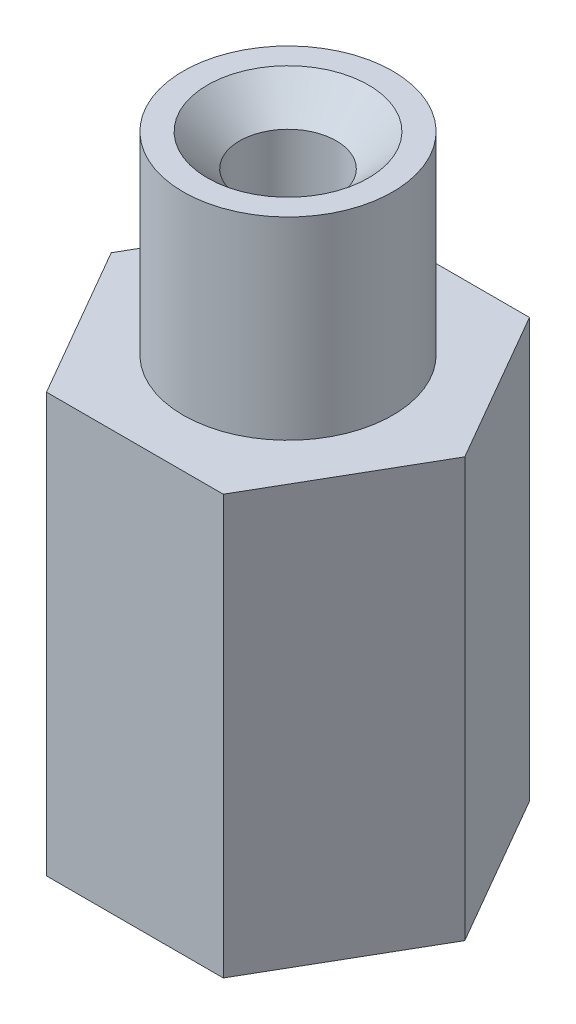
ISO-10303-21;
HEADER;
FILE_DESCRIPTION(('STEP AP214'),'2;1');
FILE_NAME('part.step','',(''),(''),'','','');
FILE_SCHEMA(('AUTOMOTIVE_DESIGN { 1 0 10303 214 1 1 1 1 }'));
ENDSEC;
DATA;
#1=APPLICATION_CONTEXT('core data for automotive mechanical design processes');
#2=APPLICATION_PROTOCOL_DEFINITION('international standard','automotive_design',2000,#1);
#3=PRODUCT_CONTEXT('',#1,'mechanical');
#4=PRODUCT('Part','Part','',(#3));
#5=PRODUCT_RELATED_PRODUCT_CATEGORY('part','',(#4));
#6=PRODUCT_DEFINITION_FORMATION('','',#4);
#7=PRODUCT_DEFINITION_CONTEXT('part definition',#1,'design');
#8=PRODUCT_DEFINITION('design','',#6,#7);
#9=PRODUCT_DEFINITION_SHAPE('','',#8);
#10=(LENGTH_UNIT() NAMED_UNIT(*) SI_UNIT(.MILLI.,.METRE.));
#11=(NAMED_UNIT(*) PLANE_ANGLE_UNIT() SI_UNIT($,.RADIAN.));
#12=(NAMED_UNIT(*) SI_UNIT($,.STERADIAN.) SOLID_ANGLE_UNIT());
#13=UNCERTAINTY_MEASURE_WITH_UNIT(LENGTH_MEASURE(1.E-05),#10,'distance_accuracy_value','');
#14=(GEOMETRIC_REPRESENTATION_CONTEXT(3) GLOBAL_UNCERTAINTY_ASSIGNED_CONTEXT((#13)) GLOBAL_UNIT_ASSIGNED_CONTEXT((#10,
#11,#12)) REPRESENTATION_CONTEXT('',''));
#15=CARTESIAN_POINT('',(0.,0.,0.));
#16=DIRECTION('',(0.,0.,1.));
#17=DIRECTION('',(1.,0.,0.));
#18=AXIS2_PLACEMENT_3D('',#15,#16,#17);
#19=CARTESIAN_POINT('',(0.,-17.,-9.49999999999998));
#20=DIRECTION('',(0.,0.,-1.));
#21=DIRECTION('',(-1.,0.,0.));
#22=AXIS2_PLACEMENT_3D('',#19,#20,#21);
#23=PLANE('',#22);
#24=DIRECTION('',(0.,1.,0.));
#25=VECTOR('',#24,1.);
#26=CARTESIAN_POINT('',(-5.48482755730155,-17.,-9.49999999999992));
#27=LINE('',#26,#25);
#28=CARTESIAN_POINT('',(-5.48482755730155,-17.,-9.49999999999992));
#29=VERTEX_POINT('',#28);
#30=CARTESIAN_POINT('',(-5.48482755730155,9.,-9.49999999999992));
#31=VERTEX_POINT('',#30);
#32=EDGE_CURVE('E99',#29,#31,#27,.T.);
#33=ORIENTED_EDGE('',*,*,#32,.T.);
#34=DIRECTION('',(-1.,0.,0.));
#35=VECTOR('',#34,1.);
#36=CARTESIAN_POINT('',(0.,9.,-9.49999999999998));
#37=LINE('',#36,#35);
#38=CARTESIAN_POINT('',(5.48482755730135,9.,-9.50000000000004));
#39=VERTEX_POINT('',#38);
#40=EDGE_CURVE('E102',#39,#31,#37,.T.);
#41=ORIENTED_EDGE('',*,*,#40,.F.);
#42=DIRECTION('',(0.,1.,0.));
#43=VECTOR('',#42,1.);
#44=CARTESIAN_POINT('',(5.48482755730135,-17.,-9.50000000000004));
#45=LINE('',#44,#43);
#46=CARTESIAN_POINT('',(5.48482755730135,-17.,-9.50000000000004));
#47=VERTEX_POINT('',#46);
#48=EDGE_CURVE('E62',#47,#39,#45,.T.);
#49=ORIENTED_EDGE('',*,*,#48,.F.);
#50=DIRECTION('',(-1.,0.,0.));
#51=VECTOR('',#50,1.);
#52=CARTESIAN_POINT('',(0.,-17.,-9.49999999999998));
#53=LINE('',#52,#51);
#54=EDGE_CURVE('E103',#47,#29,#53,.T.);
#55=ORIENTED_EDGE('',*,*,#54,.T.);
#56=EDGE_LOOP('',(#33,#41,#49,#55));
#57=FACE_BOUND('',#56,.T.);
#58=ADVANCED_FACE('F45',(#57),#23,.T.);
#59=CARTESIAN_POINT('',(8.22724133595211,-17.,-4.75000000000006));
#60=DIRECTION('',(0.866025403784435,0.,-0.500000000000007));
#61=DIRECTION('',(-0.500000000000007,0.,-0.866025403784435));
#62=AXIS2_PLACEMENT_3D('',#59,#60,#61);
#63=PLANE('',#62);
#64=ORIENTED_EDGE('',*,*,#48,.T.);
#65=DIRECTION('',(-0.500000000000007,0.,-0.866025403784435));
#66=VECTOR('',#65,1.);
#67=CARTESIAN_POINT('',(8.22724133595211,9.,-4.75000000000006));
#68=LINE('',#67,#66);
#69=CARTESIAN_POINT('',(10.9696551146029,9.,0.));
#70=VERTEX_POINT('',#69);
#71=EDGE_CURVE('E123',#70,#39,#68,.T.);
#72=ORIENTED_EDGE('',*,*,#71,.F.);
#73=DIRECTION('',(0.,1.,0.));
#74=VECTOR('',#73,1.);
#75=CARTESIAN_POINT('',(10.9696551146029,-17.,0.));
#76=LINE('',#75,#74);
#77=CARTESIAN_POINT('',(10.9696551146029,-17.,0.));
#78=VERTEX_POINT('',#77);
#79=EDGE_CURVE('E70',#78,#70,#76,.T.);
#80=ORIENTED_EDGE('',*,*,#79,.F.);
#81=DIRECTION('',(-0.500000000000007,0.,-0.866025403784435));
#82=VECTOR('',#81,1.);
#83=CARTESIAN_POINT('',(8.22724133595211,-17.,-4.75000000000006));
#84=LINE('',#83,#82);
#85=EDGE_CURVE('E109',#78,#47,#84,.T.);
#86=ORIENTED_EDGE('',*,*,#85,.T.);
#87=EDGE_LOOP('',(#64,#72,#80,#86));
#88=FACE_BOUND('',#87,.T.);
#89=ADVANCED_FACE('F211',(#88),#63,.T.);
#90=CARTESIAN_POINT('',(8.22724133595218,-17.,4.74999999999994));
#91=DIRECTION('',(0.866025403784442,0.,0.499999999999995));
#92=DIRECTION('',(0.499999999999995,0.,-0.866025403784442));
#93=AXIS2_PLACEMENT_3D('',#90,#91,#92);
#94=PLANE('',#93);
#95=ORIENTED_EDGE('',*,*,#79,.T.);
#96=DIRECTION('',(0.499999999999995,0.,-0.866025403784442));
#97=VECTOR('',#96,1.);
#98=CARTESIAN_POINT('',(8.22724133595218,9.,4.74999999999994));
#99=LINE('',#98,#97);
#100=CARTESIAN_POINT('',(5.48482755730148,9.,9.49999999999996));
#101=VERTEX_POINT('',#100);
#102=EDGE_CURVE('E141',#101,#70,#99,.T.);
#103=ORIENTED_EDGE('',*,*,#102,.F.);
#104=DIRECTION('',(0.,1.,0.));
#105=VECTOR('',#104,1.);
#106=CARTESIAN_POINT('',(5.48482755730148,-17.,9.49999999999996));
#107=LINE('',#106,#105);
#108=CARTESIAN_POINT('',(5.48482755730148,-17.,9.49999999999996));
#109=VERTEX_POINT('',#108);
#110=EDGE_CURVE('E169',#109,#101,#107,.T.);
#111=ORIENTED_EDGE('',*,*,#110,.F.);
#112=DIRECTION('',(0.499999999999995,0.,-0.866025403784442));
#113=VECTOR('',#112,1.);
#114=CARTESIAN_POINT('',(8.22724133595218,-17.,4.74999999999994));
#115=LINE('',#114,#113);
#116=EDGE_CURVE('E159',#109,#78,#115,.T.);
#117=ORIENTED_EDGE('',*,*,#116,.T.);
#118=EDGE_LOOP('',(#95,#103,#111,#117));
#119=FACE_BOUND('',#118,.T.);
#120=ADVANCED_FACE('F216',(#119),#94,.T.);
#121=CARTESIAN_POINT('',(0.,-17.,9.49999999999998));
#122=DIRECTION('',(0.,0.,1.));
#123=DIRECTION('',(1.,0.,0.));
#124=AXIS2_PLACEMENT_3D('',#121,#122,#123);
#125=PLANE('',#124);
#126=ORIENTED_EDGE('',*,*,#110,.T.);
#127=DIRECTION('',(1.,0.,0.));
#128=VECTOR('',#127,1.);
#129=CARTESIAN_POINT('',(0.,9.,9.49999999999998));
#130=LINE('',#129,#128);
#131=CARTESIAN_POINT('',(-5.48482755730141,9.,9.5));
#132=VERTEX_POINT('',#131);
#133=EDGE_CURVE('E137',#132,#101,#130,.T.);
#134=ORIENTED_EDGE('',*,*,#133,.F.);
#135=DIRECTION('',(0.,1.,0.));
#136=VECTOR('',#135,1.);
#137=CARTESIAN_POINT('',(-5.48482755730141,-17.,9.5));
#138=LINE('',#137,#136);
#139=CARTESIAN_POINT('',(-5.48482755730141,-17.,9.5));
#140=VERTEX_POINT('',#139);
#141=EDGE_CURVE('E172',#140,#132,#138,.T.);
#142=ORIENTED_EDGE('',*,*,#141,.F.);
#143=DIRECTION('',(1.,0.,0.));
#144=VECTOR('',#143,1.);
#145=CARTESIAN_POINT('',(0.,-17.,9.49999999999998));
#146=LINE('',#145,#144);
#147=EDGE_CURVE('E155',#140,#109,#146,.T.);
#148=ORIENTED_EDGE('',*,*,#147,.T.);
#149=EDGE_LOOP('',(#126,#134,#142,#148));
#150=FACE_BOUND('',#149,.T.);
#151=ADVANCED_FACE('F256',(#150),#125,.T.);
#152=CARTESIAN_POINT('',(-8.22724133595214,-17.,4.75));
#153=DIRECTION('',(-0.866025403784438,0.,0.500000000000001));
#154=DIRECTION('',(0.500000000000001,0.,0.866025403784438));
#155=AXIS2_PLACEMENT_3D('',#152,#153,#154);
#156=PLANE('',#155);
#157=ORIENTED_EDGE('',*,*,#141,.T.);
#158=DIRECTION('',(0.500000000000001,0.,0.866025403784438));
#159=VECTOR('',#158,1.);
#160=CARTESIAN_POINT('',(-8.22724133595214,9.,4.75));
#161=LINE('',#160,#159);
#162=CARTESIAN_POINT('',(-10.9696551146029,9.,0.));
#163=VERTEX_POINT('',#162);
#164=EDGE_CURVE('E118',#163,#132,#161,.T.);
#165=ORIENTED_EDGE('',*,*,#164,.F.);
#166=DIRECTION('',(0.,1.,0.));
#167=VECTOR('',#166,1.);
#168=CARTESIAN_POINT('',(-10.9696551146029,-17.,0.));
#169=LINE('',#168,#167);
#170=CARTESIAN_POINT('',(-10.9696551146029,-17.,0.));
#171=VERTEX_POINT('',#170);
#172=EDGE_CURVE('E108',#171,#163,#169,.T.);
#173=ORIENTED_EDGE('',*,*,#172,.F.);
#174=DIRECTION('',(0.500000000000001,0.,0.866025403784438));
#175=VECTOR('',#174,1.);
#176=CARTESIAN_POINT('',(-8.22724133595214,-17.,4.75));
#177=LINE('',#176,#175);
#178=EDGE_CURVE('E151',#171,#140,#177,.T.);
#179=ORIENTED_EDGE('',*,*,#178,.T.);
#180=EDGE_LOOP('',(#157,#165,#173,#179));
#181=FACE_BOUND('',#180,.T.);
#182=ADVANCED_FACE('F252',(#181),#156,.T.);
#183=CARTESIAN_POINT('',(-8.22724133595221,-17.,-4.74999999999996));
#184=DIRECTION('',(-0.866025403784441,0.,-0.499999999999995));
#185=DIRECTION('',(-0.499999999999995,0.,0.866025403784442));
#186=AXIS2_PLACEMENT_3D('',#183,#184,#185);
#187=PLANE('',#186);
#188=ORIENTED_EDGE('',*,*,#172,.T.);
#189=DIRECTION('',(-0.499999999999995,0.,0.866025403784442));
#190=VECTOR('',#189,1.);
#191=CARTESIAN_POINT('',(-8.22724133595221,9.,-4.74999999999996));
#192=LINE('',#191,#190);
#193=EDGE_CURVE('E112',#31,#163,#192,.T.);
#194=ORIENTED_EDGE('',*,*,#193,.F.);
#195=ORIENTED_EDGE('',*,*,#32,.F.);
#196=DIRECTION('',(-0.499999999999995,0.,0.866025403784442));
#197=VECTOR('',#196,1.);
#198=CARTESIAN_POINT('',(-8.22724133595221,-17.,-4.74999999999996));
#199=LINE('',#198,#197);
#200=EDGE_CURVE('E148',#29,#171,#199,.T.);
#201=ORIENTED_EDGE('',*,*,#200,.T.);
#202=EDGE_LOOP('',(#188,#194,#195,#201));
#203=FACE_BOUND('',#202,.T.);
#204=ADVANCED_FACE('F113',(#203),#187,.T.);
#205=CARTESIAN_POINT('',(0.,-17.,0.));
#206=DIRECTION('',(0.,1.,0.));
#207=DIRECTION('',(0.,0.,1.));
#208=AXIS2_PLACEMENT_3D('',#205,#206,#207);
#209=CYLINDRICAL_SURFACE('',#208,3.);
#210=CARTESIAN_POINT('',(0.,-11.5,0.));
#211=DIRECTION('',(0.,-1.,0.));
#212=DIRECTION('',(0.,0.,-1.));
#213=AXIS2_PLACEMENT_3D('',#210,#211,#212);
#214=CIRCLE('',#213,3.);
#215=CARTESIAN_POINT('',(0.,-11.5,-3.));
#216=VERTEX_POINT('',#215);
#217=EDGE_CURVE('E55',#216,#216,#214,.T.);
#218=ORIENTED_EDGE('',*,*,#217,.T.);
#219=EDGE_LOOP('',(#218));
#220=FACE_BOUND('',#219,.T.);
#221=CARTESIAN_POINT('',(0.,19.,0.));
#222=DIRECTION('',(0.,1.,0.));
#223=DIRECTION('',(0.,0.,1.));
#224=AXIS2_PLACEMENT_3D('',#221,#222,#223);
#225=CIRCLE('',#224,3.);
#226=CARTESIAN_POINT('',(0.,19.,3.));
#227=VERTEX_POINT('',#226);
#228=EDGE_CURVE('E166',#227,#227,#225,.T.);
#229=ORIENTED_EDGE('',*,*,#228,.T.);
#230=EDGE_LOOP('',(#229));
#231=FACE_BOUND('',#230,.T.);
#232=ADVANCED_FACE('F197',(#220,#231),#209,.F.);
#233=CARTESIAN_POINT('',(0.,-17.,0.));
#234=DIRECTION('',(0.,1.,0.));
#235=DIRECTION('',(0.,0.,1.));
#236=AXIS2_PLACEMENT_3D('',#233,#234,#235);
#237=PLANE('',#236);
#238=CARTESIAN_POINT('',(0.,-17.,0.));
#239=DIRECTION('',(0.,1.,0.));
#240=DIRECTION('',(0.,0.,1.));
#241=AXIS2_PLACEMENT_3D('',#238,#239,#240);
#242=CIRCLE('',#241,7.);
#243=CARTESIAN_POINT('',(0.,-17.,7.));
#244=VERTEX_POINT('',#243);
#245=EDGE_CURVE('E184',#244,#244,#242,.T.);
#246=ORIENTED_EDGE('',*,*,#245,.T.);
#247=EDGE_LOOP('',(#246));
#248=FACE_BOUND('',#247,.T.);
#249=ORIENTED_EDGE('',*,*,#54,.F.);
#250=ORIENTED_EDGE('',*,*,#85,.F.);
#251=ORIENTED_EDGE('',*,*,#116,.F.);
#252=ORIENTED_EDGE('',*,*,#147,.F.);
#253=ORIENTED_EDGE('',*,*,#178,.F.);
#254=ORIENTED_EDGE('',*,*,#200,.F.);
#255=EDGE_LOOP('',(#249,#250,#251,#252,#253,#254));
#256=FACE_BOUND('',#255,.T.);
#257=ADVANCED_FACE('F244',(#248,#256),#237,.F.);
#258=CARTESIAN_POINT('',(0.,9.,0.));
#259=DIRECTION('',(0.,1.,0.));
#260=DIRECTION('',(0.,0.,1.));
#261=AXIS2_PLACEMENT_3D('',#258,#259,#260);
#262=PLANE('',#261);
#263=CARTESIAN_POINT('',(0.,9.,0.));
#264=DIRECTION('',(0.,1.,0.));
#265=DIRECTION('',(0.,0.,1.));
#266=AXIS2_PLACEMENT_3D('',#263,#264,#265);
#267=CIRCLE('',#266,6.5);
#268=CARTESIAN_POINT('',(0.,9.,-6.5));
#269=VERTEX_POINT('',#268);
#270=EDGE_CURVE('E125',#269,#269,#267,.F.);
#271=ORIENTED_EDGE('',*,*,#270,.T.);
#272=EDGE_LOOP('',(#271));
#273=FACE_BOUND('',#272,.T.);
#274=ORIENTED_EDGE('',*,*,#40,.T.);
#275=ORIENTED_EDGE('',*,*,#193,.T.);
#276=ORIENTED_EDGE('',*,*,#164,.T.);
#277=ORIENTED_EDGE('',*,*,#133,.T.);
#278=ORIENTED_EDGE('',*,*,#102,.T.);
#279=ORIENTED_EDGE('',*,*,#71,.T.);
#280=EDGE_LOOP('',(#274,#275,#276,#277,#278,#279));
#281=FACE_BOUND('',#280,.T.);
#282=ADVANCED_FACE('F121',(#273,#281),#262,.T.);
#283=CARTESIAN_POINT('',(0.,21.,0.));
#284=DIRECTION('',(0.,-1.,0.));
#285=DIRECTION('',(0.,0.,-1.));
#286=AXIS2_PLACEMENT_3D('',#283,#284,#285);
#287=CYLINDRICAL_SURFACE('',#286,6.5);
#288=CARTESIAN_POINT('',(0.,21.,0.));
#289=DIRECTION('',(0.,1.,0.));
#290=DIRECTION('',(0.,0.,1.));
#291=AXIS2_PLACEMENT_3D('',#288,#289,#290);
#292=CIRCLE('',#291,6.5);
#293=CARTESIAN_POINT('',(0.,21.,-6.5));
#294=VERTEX_POINT('',#293);
#295=EDGE_CURVE('E130',#294,#294,#292,.T.);
#296=CARTESIAN_POINT('',(0.,9.,-6.5));
#297=CARTESIAN_POINT('',(0.,9.125,-6.5));
#298=CARTESIAN_POINT('',(0.,9.25,-6.5));
#299=CARTESIAN_POINT('',(0.,9.5,-6.5));
#300=CARTESIAN_POINT('',(0.,9.625,-6.5));
#301=CARTESIAN_POINT('',(0.,9.875,-6.5));
#302=CARTESIAN_POINT('',(0.,10.,-6.5));
#303=CARTESIAN_POINT('',(0.,10.25,-6.5));
#304=CARTESIAN_POINT('',(0.,10.375,-6.5));
#305=CARTESIAN_POINT('',(0.,10.625,-6.5));
#306=CARTESIAN_POINT('',(0.,10.75,-6.5));
#307=CARTESIAN_POINT('',(0.,11.,-6.5));
#308=CARTESIAN_POINT('',(0.,11.125,-6.5));
#309=CARTESIAN_POINT('',(0.,11.375,-6.5));
#310=CARTESIAN_POINT('',(0.,11.5,-6.5));
#311=CARTESIAN_POINT('',(0.,11.75,-6.5));
#312=CARTESIAN_POINT('',(0.,11.875,-6.5));
#313=CARTESIAN_POINT('',(0.,12.125,-6.5));
#314=CARTESIAN_POINT('',(0.,12.25,-6.5));
#315=CARTESIAN_POINT('',(0.,12.5,-6.5));
#316=CARTESIAN_POINT('',(0.,12.625,-6.5));
#317=CARTESIAN_POINT('',(0.,12.875,-6.5));
#318=CARTESIAN_POINT('',(0.,13.,-6.5));
#319=CARTESIAN_POINT('',(0.,13.25,-6.5));
#320=CARTESIAN_POINT('',(0.,13.375,-6.5));
#321=CARTESIAN_POINT('',(0.,13.625,-6.5));
#322=CARTESIAN_POINT('',(0.,13.75,-6.5));
#323=CARTESIAN_POINT('',(0.,14.,-6.5));
#324=CARTESIAN_POINT('',(0.,14.125,-6.5));
#325=CARTESIAN_POINT('',(0.,14.375,-6.5));
#326=CARTESIAN_POINT('',(0.,14.5,-6.5));
#327=CARTESIAN_POINT('',(0.,14.75,-6.5));
#328=CARTESIAN_POINT('',(0.,14.875,-6.5));
#329=CARTESIAN_POINT('',(0.,15.125,-6.5));
#330=CARTESIAN_POINT('',(0.,15.25,-6.5));
#331=CARTESIAN_POINT('',(0.,15.5,-6.5));
#332=CARTESIAN_POINT('',(0.,15.625,-6.5));
#333=CARTESIAN_POINT('',(0.,15.875,-6.5));
#334=CARTESIAN_POINT('',(0.,16.,-6.5));
#335=CARTESIAN_POINT('',(0.,16.25,-6.5));
#336=CARTESIAN_POINT('',(0.,16.375,-6.5));
#337=CARTESIAN_POINT('',(0.,16.625,-6.5));
#338=CARTESIAN_POINT('',(0.,16.75,-6.5));
#339=CARTESIAN_POINT('',(0.,17.,-6.5));
#340=CARTESIAN_POINT('',(0.,17.125,-6.5));
#341=CARTESIAN_POINT('',(0.,17.375,-6.5));
#342=CARTESIAN_POINT('',(0.,17.5,-6.5));
#343=CARTESIAN_POINT('',(0.,17.75,-6.5));
#344=CARTESIAN_POINT('',(0.,17.875,-6.5));
#345=CARTESIAN_POINT('',(0.,18.125,-6.5));
#346=CARTESIAN_POINT('',(0.,18.25,-6.5));
#347=CARTESIAN_POINT('',(0.,18.5,-6.5));
#348=CARTESIAN_POINT('',(0.,18.625,-6.5));
#349=CARTESIAN_POINT('',(0.,18.875,-6.5));
#350=CARTESIAN_POINT('',(0.,19.,-6.5));
#351=CARTESIAN_POINT('',(0.,19.25,-6.5));
#352=CARTESIAN_POINT('',(0.,19.375,-6.5));
#353=CARTESIAN_POINT('',(0.,19.625,-6.5));
#354=CARTESIAN_POINT('',(0.,19.75,-6.5));
#355=CARTESIAN_POINT('',(0.,20.,-6.5));
#356=CARTESIAN_POINT('',(0.,20.125,-6.5));
#357=CARTESIAN_POINT('',(0.,20.375,-6.5));
#358=CARTESIAN_POINT('',(0.,20.5,-6.5));
#359=CARTESIAN_POINT('',(0.,20.75,-6.5));
#360=CARTESIAN_POINT('',(0.,20.875,-6.5));
#361=CARTESIAN_POINT('',(0.,21.,-6.5));
#362=B_SPLINE_CURVE_WITH_KNOTS('',3,(#296,#297,#298,#299,#300,#301,#302,#303,#304,#305,#306,
#307,#308,#309,#310,#311,#312,#313,#314,#315,#316,#317,#318,#319,#320,#321,#322,#323,#324,#325,
#326,#327,#328,#329,#330,#331,#332,#333,#334,#335,#336,#337,#338,#339,#340,#341,#342,#343,#344,
#345,#346,#347,#348,#349,#350,#351,#352,#353,#354,#355,#356,#357,#358,#359,#360,#361),
.UNSPECIFIED.,.F.,.F.,(4,2,2,2,2,2,2,2,2,2,2,2,2,2,2,2,2,2,2,2,2,2,2,2,2,2,2,2,2,2,2,2,4),(0.,
0.375,0.750000000000001,1.125,1.5,1.875,2.25,2.625,3.,3.375,3.75,4.125,4.5,4.875,5.25,5.625,6.,
6.375,6.75,7.125,7.5,7.875,8.25,8.625,9.,9.375,9.75,10.125,10.5,10.875,11.25,11.625,12.),.UNSPECIFIED.);
#363=EDGE_CURVE('BSEAM277',#269,#294,#362,.T.);
#364=ORIENTED_EDGE('',*,*,#270,.F.);
#365=ORIENTED_EDGE('',*,*,#295,.F.);
#366=ORIENTED_EDGE('',*,*,#363,.T.);
#367=ORIENTED_EDGE('',*,*,#363,.F.);
#368=EDGE_LOOP('',(#364,#366,#365,#367));
#369=FACE_BOUND('',#368,.T.);
#370=ADVANCED_FACE('F277',(#369),#287,.T.);
#371=CARTESIAN_POINT('',(0.,21.,0.));
#372=DIRECTION('',(0.,1.,0.));
#373=DIRECTION('',(0.,0.,1.));
#374=AXIS2_PLACEMENT_3D('',#371,#372,#373);
#375=PLANE('',#374);
#376=CARTESIAN_POINT('',(0.,21.,0.));
#377=DIRECTION('',(0.,1.,0.));
#378=DIRECTION('',(0.,0.,1.));
#379=AXIS2_PLACEMENT_3D('',#376,#377,#378);
#380=CIRCLE('',#379,5.);
#381=CARTESIAN_POINT('',(0.,21.,5.));
#382=VERTEX_POINT('',#381);
#383=EDGE_CURVE('E180',#382,#382,#380,.F.);
#384=ORIENTED_EDGE('',*,*,#383,.T.);
#385=EDGE_LOOP('',(#384));
#386=FACE_BOUND('',#385,.T.);
#387=ORIENTED_EDGE('',*,*,#295,.T.);
#388=EDGE_LOOP('',(#387));
#389=FACE_BOUND('',#388,.T.);
#390=ADVANCED_FACE('F228',(#386,#389),#375,.T.);
#391=CARTESIAN_POINT('',(0.,19.,0.));
#392=DIRECTION('',(0.,1.,0.));
#393=DIRECTION('',(0.,0.,1.));
#394=AXIS2_PLACEMENT_3D('',#391,#392,#393);
#395=CONICAL_SURFACE('',#394,3.,0.785398163397445);
#396=ORIENTED_EDGE('',*,*,#383,.F.);
#397=EDGE_LOOP('',(#396));
#398=FACE_BOUND('',#397,.T.);
#399=ORIENTED_EDGE('',*,*,#228,.F.);
#400=EDGE_LOOP('',(#399));
#401=FACE_BOUND('',#400,.T.);
#402=ADVANCED_FACE('F222',(#398,#401),#395,.F.);
#403=CARTESIAN_POINT('',(0.,-17.,0.));
#404=DIRECTION('',(0.,-1.,0.));
#405=DIRECTION('',(0.,0.,-1.));
#406=AXIS2_PLACEMENT_3D('',#403,#404,#405);
#407=CONICAL_SURFACE('',#406,7.,0.785398163397447);
#408=CARTESIAN_POINT('',(0.,-16.,0.));
#409=DIRECTION('',(0.,-1.,0.));
#410=DIRECTION('',(0.,0.,-1.));
#411=AXIS2_PLACEMENT_3D('',#408,#409,#410);
#412=CIRCLE('',#411,6.);
#413=CARTESIAN_POINT('',(0.,-16.,-6.));
#414=VERTEX_POINT('',#413);
#415=EDGE_CURVE('E188',#414,#414,#412,.T.);
#416=ORIENTED_EDGE('',*,*,#415,.F.);
#417=EDGE_LOOP('',(#416));
#418=FACE_BOUND('',#417,.T.);
#419=ORIENTED_EDGE('',*,*,#245,.F.);
#420=EDGE_LOOP('',(#419));
#421=FACE_BOUND('',#420,.T.);
#422=ADVANCED_FACE('F227',(#418,#421),#407,.F.);
#423=CARTESIAN_POINT('',(0.,-13.,0.));
#424=DIRECTION('',(0.,-1.,0.));
#425=DIRECTION('',(0.,0.,-1.));
#426=AXIS2_PLACEMENT_3D('',#423,#424,#425);
#427=CYLINDRICAL_SURFACE('',#426,6.);
#428=ORIENTED_EDGE('',*,*,#415,.T.);
#429=EDGE_LOOP('',(#428));
#430=FACE_BOUND('',#429,.T.);
#431=CARTESIAN_POINT('',(0.,-13.,0.));
#432=DIRECTION('',(0.,-1.,0.));
#433=DIRECTION('',(0.,0.,-1.));
#434=AXIS2_PLACEMENT_3D('',#431,#432,#433);
#435=CIRCLE('',#434,6.);
#436=CARTESIAN_POINT('',(0.,-13.,-6.));
#437=VERTEX_POINT('',#436);
#438=EDGE_CURVE('E191',#437,#437,#435,.T.);
#439=ORIENTED_EDGE('',*,*,#438,.F.);
#440=EDGE_LOOP('',(#439));
#441=FACE_BOUND('',#440,.T.);
#442=ADVANCED_FACE('F206',(#430,#441),#427,.F.);
#443=CARTESIAN_POINT('',(0.,-13.,0.));
#444=DIRECTION('',(0.,-1.,0.));
#445=DIRECTION('',(0.,0.,-1.));
#446=AXIS2_PLACEMENT_3D('',#443,#444,#445);
#447=PLANE('',#446);
#448=CARTESIAN_POINT('',(0.,-13.,0.));
#449=DIRECTION('',(0.,-1.,0.));
#450=DIRECTION('',(0.,0.,-1.));
#451=AXIS2_PLACEMENT_3D('',#448,#449,#450);
#452=CIRCLE('',#451,4.50000000000002);
#453=CARTESIAN_POINT('',(0.,-13.,-4.50000000000002));
#454=VERTEX_POINT('',#453);
#455=EDGE_CURVE('E11',#454,#454,#452,.F.);
#456=ORIENTED_EDGE('',*,*,#455,.T.);
#457=EDGE_LOOP('',(#456));
#458=FACE_BOUND('',#457,.T.);
#459=ORIENTED_EDGE('',*,*,#438,.T.);
#460=EDGE_LOOP('',(#459));
#461=FACE_BOUND('',#460,.T.);
#462=ADVANCED_FACE('F201',(#458,#461),#447,.T.);
#463=CARTESIAN_POINT('',(0.,-11.5,0.));
#464=DIRECTION('',(0.,-1.,0.));
#465=DIRECTION('',(0.,0.,-1.));
#466=AXIS2_PLACEMENT_3D('',#463,#464,#465);
#467=CONICAL_SURFACE('',#466,3.,0.78539816339745);
#468=ORIENTED_EDGE('',*,*,#455,.F.);
#469=EDGE_LOOP('',(#468));
#470=FACE_BOUND('',#469,.T.);
#471=ORIENTED_EDGE('',*,*,#217,.F.);
#472=EDGE_LOOP('',(#471));
#473=FACE_BOUND('',#472,.T.);
#474=ADVANCED_FACE('F48',(#470,#473),#467,.F.);
#475=CLOSED_SHELL('',(#58,#89,#120,#151,#182,#204,#232,#257,#282,#370,#390,#402,#422,#442,#462,#474));
#476=MANIFOLD_SOLID_BREP('B2',#475);
#477=ADVANCED_BREP_SHAPE_REPRESENTATION('',(#18,#476),#14);
#478=SHAPE_DEFINITION_REPRESENTATION(#9,#477);
ENDSEC;
END-ISO-10303-21;
